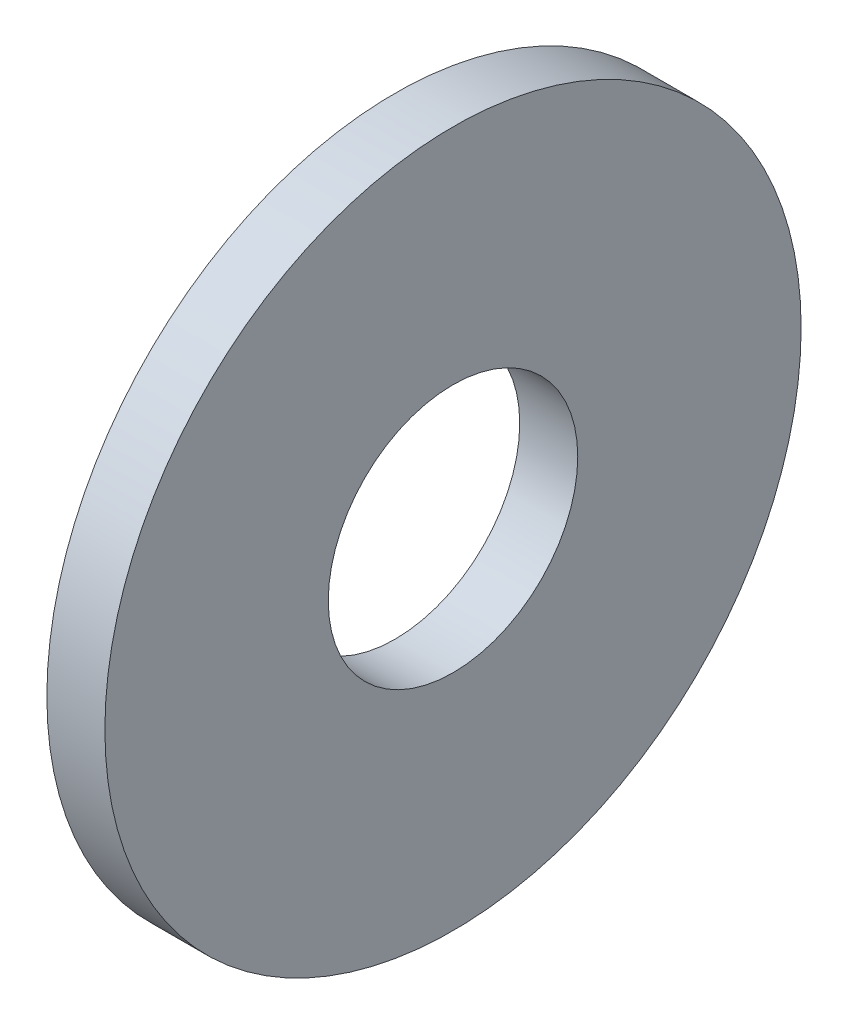
ISO-10303-21;
HEADER;
FILE_DESCRIPTION(('STEP AP214'),'2;1');
FILE_NAME('part.step','',(''),(''),'','','');
FILE_SCHEMA(('AUTOMOTIVE_DESIGN { 1 0 10303 214 1 1 1 1 }'));
ENDSEC;
DATA;
#1=APPLICATION_CONTEXT('core data for automotive mechanical design processes');
#2=APPLICATION_PROTOCOL_DEFINITION('international standard','automotive_design',2000,#1);
#3=PRODUCT_CONTEXT('',#1,'mechanical');
#4=PRODUCT('Part','Part','',(#3));
#5=PRODUCT_RELATED_PRODUCT_CATEGORY('part','',(#4));
#6=PRODUCT_DEFINITION_FORMATION('','',#4);
#7=PRODUCT_DEFINITION_CONTEXT('part definition',#1,'design');
#8=PRODUCT_DEFINITION('design','',#6,#7);
#9=PRODUCT_DEFINITION_SHAPE('','',#8);
#10=(LENGTH_UNIT() NAMED_UNIT(*) SI_UNIT(.MILLI.,.METRE.));
#11=(NAMED_UNIT(*) PLANE_ANGLE_UNIT() SI_UNIT($,.RADIAN.));
#12=(NAMED_UNIT(*) SI_UNIT($,.STERADIAN.) SOLID_ANGLE_UNIT());
#13=UNCERTAINTY_MEASURE_WITH_UNIT(LENGTH_MEASURE(1.E-05),#10,'distance_accuracy_value','');
#14=(GEOMETRIC_REPRESENTATION_CONTEXT(3) GLOBAL_UNCERTAINTY_ASSIGNED_CONTEXT((#13)) GLOBAL_UNIT_ASSIGNED_CONTEXT((#10,
#11,#12)) REPRESENTATION_CONTEXT('',''));
#15=CARTESIAN_POINT('',(0.,0.,0.));
#16=DIRECTION('',(0.,0.,1.));
#17=DIRECTION('',(1.,0.,0.));
#18=AXIS2_PLACEMENT_3D('',#15,#16,#17);
#19=CARTESIAN_POINT('',(-34.9249999999999,0.,0.));
#20=DIRECTION('',(-1.,0.,0.));
#21=DIRECTION('',(0.,0.,1.));
#22=AXIS2_PLACEMENT_3D('',#19,#20,#21);
#23=CYLINDRICAL_SURFACE('',#22,2.15);
#24=CARTESIAN_POINT('',(0.,0.,0.));
#25=DIRECTION('',(-1.,0.,0.));
#26=DIRECTION('',(0.,0.,1.));
#27=AXIS2_PLACEMENT_3D('',#24,#25,#26);
#28=CIRCLE('',#27,2.15);
#29=CARTESIAN_POINT('',(0.,0.,2.15));
#30=VERTEX_POINT('',#29);
#31=EDGE_CURVE('E10',#30,#30,#28,.T.);
#32=ORIENTED_EDGE('',*,*,#31,.F.);
#33=EDGE_LOOP('',(#32));
#34=FACE_BOUND('',#33,.T.);
#35=CARTESIAN_POINT('',(-1.,0.,0.));
#36=DIRECTION('',(-1.,0.,0.));
#37=DIRECTION('',(0.,0.,1.));
#38=AXIS2_PLACEMENT_3D('',#35,#36,#37);
#39=CIRCLE('',#38,2.15);
#40=CARTESIAN_POINT('',(-1.,0.,2.15));
#41=VERTEX_POINT('',#40);
#42=EDGE_CURVE('E44',#41,#41,#39,.T.);
#43=ORIENTED_EDGE('',*,*,#42,.T.);
#44=EDGE_LOOP('',(#43));
#45=FACE_BOUND('',#44,.T.);
#46=ADVANCED_FACE('F30',(#34,#45),#23,.F.);
#47=CARTESIAN_POINT('',(0.,2.15,0.));
#48=DIRECTION('',(-1.,0.,0.));
#49=DIRECTION('',(0.,0.,1.));
#50=AXIS2_PLACEMENT_3D('',#47,#48,#49);
#51=PLANE('',#50);
#52=CARTESIAN_POINT('',(0.,0.,0.));
#53=DIRECTION('',(-1.,0.,0.));
#54=DIRECTION('',(0.,0.,1.));
#55=AXIS2_PLACEMENT_3D('',#52,#53,#54);
#56=CIRCLE('',#55,6.);
#57=CARTESIAN_POINT('',(0.,0.,6.));
#58=VERTEX_POINT('',#57);
#59=EDGE_CURVE('E36',#58,#58,#56,.T.);
#60=ORIENTED_EDGE('',*,*,#59,.F.);
#61=EDGE_LOOP('',(#60));
#62=FACE_BOUND('',#61,.T.);
#63=ORIENTED_EDGE('',*,*,#31,.T.);
#64=EDGE_LOOP('',(#63));
#65=FACE_BOUND('',#64,.T.);
#66=ADVANCED_FACE('F59',(#62,#65),#51,.F.);
#67=CARTESIAN_POINT('',(-34.9249999999999,0.,0.));
#68=DIRECTION('',(-1.,0.,0.));
#69=DIRECTION('',(0.,0.,1.));
#70=AXIS2_PLACEMENT_3D('',#67,#68,#69);
#71=CYLINDRICAL_SURFACE('',#70,6.);
#72=CARTESIAN_POINT('',(-1.,0.,0.));
#73=DIRECTION('',(-1.,0.,0.));
#74=DIRECTION('',(0.,0.,1.));
#75=AXIS2_PLACEMENT_3D('',#72,#73,#74);
#76=CIRCLE('',#75,6.);
#77=CARTESIAN_POINT('',(-1.,0.,6.));
#78=VERTEX_POINT('',#77);
#79=EDGE_CURVE('E40',#78,#78,#76,.T.);
#80=ORIENTED_EDGE('',*,*,#79,.F.);
#81=EDGE_LOOP('',(#80));
#82=FACE_BOUND('',#81,.T.);
#83=ORIENTED_EDGE('',*,*,#59,.T.);
#84=EDGE_LOOP('',(#83));
#85=FACE_BOUND('',#84,.T.);
#86=ADVANCED_FACE('F54',(#82,#85),#71,.T.);
#87=CARTESIAN_POINT('',(-1.,6.,0.));
#88=DIRECTION('',(1.,0.,0.));
#89=DIRECTION('',(0.,0.,-1.));
#90=AXIS2_PLACEMENT_3D('',#87,#88,#89);
#91=PLANE('',#90);
#92=ORIENTED_EDGE('',*,*,#42,.F.);
#93=EDGE_LOOP('',(#92));
#94=FACE_BOUND('',#93,.T.);
#95=ORIENTED_EDGE('',*,*,#79,.T.);
#96=EDGE_LOOP('',(#95));
#97=FACE_BOUND('',#96,.T.);
#98=ADVANCED_FACE('F51',(#94,#97),#91,.F.);
#99=CLOSED_SHELL('',(#46,#66,#86,#98));
#100=MANIFOLD_SOLID_BREP('B2',#99);
#101=ADVANCED_BREP_SHAPE_REPRESENTATION('',(#18,#100),#14);
#102=SHAPE_DEFINITION_REPRESENTATION(#9,#101);
ENDSEC;
END-ISO-10303-21;
